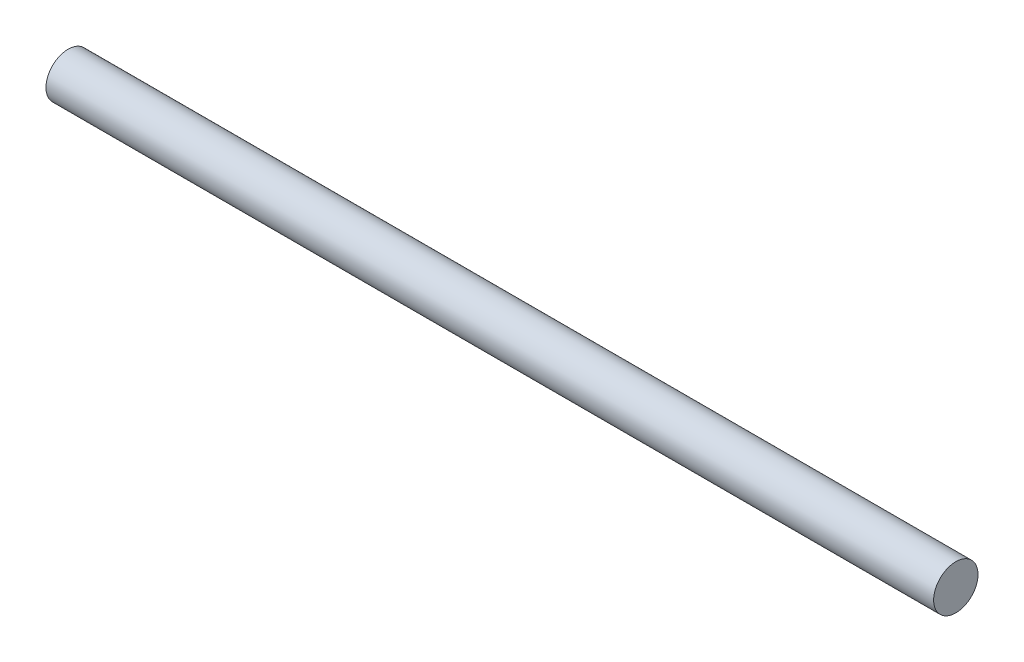
ISO-10303-21;
HEADER;
FILE_DESCRIPTION(('STEP AP214'),'2;1');
FILE_NAME('part.step','',(''),(''),'','','');
FILE_SCHEMA(('AUTOMOTIVE_DESIGN { 1 0 10303 214 1 1 1 1 }'));
ENDSEC;
DATA;
#1=APPLICATION_CONTEXT('core data for automotive mechanical design processes');
#2=APPLICATION_PROTOCOL_DEFINITION('international standard','automotive_design',2000,#1);
#3=PRODUCT_CONTEXT('',#1,'mechanical');
#4=PRODUCT('Part','Part','',(#3));
#5=PRODUCT_RELATED_PRODUCT_CATEGORY('part','',(#4));
#6=PRODUCT_DEFINITION_FORMATION('','',#4);
#7=PRODUCT_DEFINITION_CONTEXT('part definition',#1,'design');
#8=PRODUCT_DEFINITION('design','',#6,#7);
#9=PRODUCT_DEFINITION_SHAPE('','',#8);
#10=(LENGTH_UNIT() NAMED_UNIT(*) SI_UNIT(.MILLI.,.METRE.));
#11=(NAMED_UNIT(*) PLANE_ANGLE_UNIT() SI_UNIT($,.RADIAN.));
#12=(NAMED_UNIT(*) SI_UNIT($,.STERADIAN.) SOLID_ANGLE_UNIT());
#13=UNCERTAINTY_MEASURE_WITH_UNIT(LENGTH_MEASURE(1.E-05),#10,'distance_accuracy_value','');
#14=(GEOMETRIC_REPRESENTATION_CONTEXT(3) GLOBAL_UNCERTAINTY_ASSIGNED_CONTEXT((#13)) GLOBAL_UNIT_ASSIGNED_CONTEXT((#10,
#11,#12)) REPRESENTATION_CONTEXT('',''));
#15=CARTESIAN_POINT('',(0.,0.,0.));
#16=DIRECTION('',(0.,0.,1.));
#17=DIRECTION('',(1.,0.,0.));
#18=AXIS2_PLACEMENT_3D('',#15,#16,#17);
#19=CARTESIAN_POINT('',(40.,0.,0.));
#20=DIRECTION('',(-1.,0.,0.));
#21=DIRECTION('',(0.,0.,1.));
#22=AXIS2_PLACEMENT_3D('',#19,#20,#21);
#23=CYLINDRICAL_SURFACE('',#22,1.);
#24=CARTESIAN_POINT('',(40.,0.,0.));
#25=DIRECTION('',(1.,0.,0.));
#26=DIRECTION('',(0.,0.,-1.));
#27=AXIS2_PLACEMENT_3D('',#24,#25,#26);
#28=CIRCLE('',#27,1.);
#29=CARTESIAN_POINT('',(40.,0.,-1.));
#30=VERTEX_POINT('',#29);
#31=EDGE_CURVE('E12',#30,#30,#28,.T.);
#32=ORIENTED_EDGE('',*,*,#31,.F.);
#33=EDGE_LOOP('',(#32));
#34=FACE_BOUND('',#33,.T.);
#35=CARTESIAN_POINT('',(0.,0.,0.));
#36=DIRECTION('',(1.,0.,0.));
#37=DIRECTION('',(0.,0.,-1.));
#38=AXIS2_PLACEMENT_3D('',#35,#36,#37);
#39=CIRCLE('',#38,1.);
#40=CARTESIAN_POINT('',(0.,0.,-1.));
#41=VERTEX_POINT('',#40);
#42=EDGE_CURVE('E50',#41,#41,#39,.T.);
#43=ORIENTED_EDGE('',*,*,#42,.T.);
#44=EDGE_LOOP('',(#43));
#45=FACE_BOUND('',#44,.T.);
#46=ADVANCED_FACE('F47',(#34,#45),#23,.T.);
#47=CARTESIAN_POINT('',(40.,0.,0.));
#48=DIRECTION('',(1.,0.,0.));
#49=DIRECTION('',(0.,0.,-1.));
#50=AXIS2_PLACEMENT_3D('',#47,#48,#49);
#51=PLANE('',#50);
#52=ORIENTED_EDGE('',*,*,#31,.T.);
#53=EDGE_LOOP('',(#52));
#54=FACE_BOUND('',#53,.T.);
#55=ADVANCED_FACE('F64',(#54),#51,.T.);
#56=CARTESIAN_POINT('',(0.,0.,0.));
#57=DIRECTION('',(1.,0.,0.));
#58=DIRECTION('',(0.,0.,-1.));
#59=AXIS2_PLACEMENT_3D('',#56,#57,#58);
#60=PLANE('',#59);
#61=ORIENTED_EDGE('',*,*,#42,.F.);
#62=EDGE_LOOP('',(#61));
#63=FACE_BOUND('',#62,.T.);
#64=ADVANCED_FACE('F62',(#63),#60,.F.);
#65=CLOSED_SHELL('',(#46,#55,#64));
#66=MANIFOLD_SOLID_BREP('B2',#65);
#67=ADVANCED_BREP_SHAPE_REPRESENTATION('',(#18,#66),#14);
#68=SHAPE_DEFINITION_REPRESENTATION(#9,#67);
ENDSEC;
END-ISO-10303-21;
